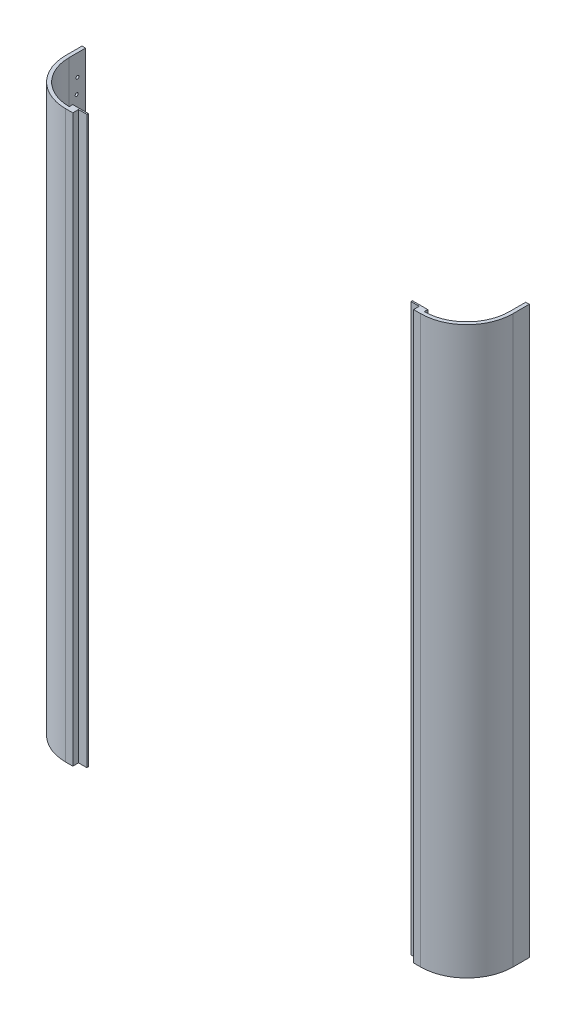
ISO-10303-21;
HEADER;
FILE_DESCRIPTION(('STEP AP214'),'2;1');
FILE_NAME('part.step','',(''),(''),'','','');
FILE_SCHEMA(('AUTOMOTIVE_DESIGN { 1 0 10303 214 1 1 1 1 }'));
ENDSEC;
DATA;
#1=APPLICATION_CONTEXT('core data for automotive mechanical design processes');
#2=APPLICATION_PROTOCOL_DEFINITION('international standard','automotive_design',2000,#1);
#3=PRODUCT_CONTEXT('',#1,'mechanical');
#4=PRODUCT('Part','Part','',(#3));
#5=PRODUCT_RELATED_PRODUCT_CATEGORY('part','',(#4));
#6=PRODUCT_DEFINITION_FORMATION('','',#4);
#7=PRODUCT_DEFINITION_CONTEXT('part definition',#1,'design');
#8=PRODUCT_DEFINITION('design','',#6,#7);
#9=PRODUCT_DEFINITION_SHAPE('','',#8);
#10=(LENGTH_UNIT() NAMED_UNIT(*) SI_UNIT(.MILLI.,.METRE.));
#11=(NAMED_UNIT(*) PLANE_ANGLE_UNIT() SI_UNIT($,.RADIAN.));
#12=(NAMED_UNIT(*) SI_UNIT($,.STERADIAN.) SOLID_ANGLE_UNIT());
#13=UNCERTAINTY_MEASURE_WITH_UNIT(LENGTH_MEASURE(1.E-05),#10,'distance_accuracy_value','');
#14=(GEOMETRIC_REPRESENTATION_CONTEXT(3) GLOBAL_UNCERTAINTY_ASSIGNED_CONTEXT((#13)) GLOBAL_UNIT_ASSIGNED_CONTEXT((#10,
#11,#12)) REPRESENTATION_CONTEXT('',''));
#15=CARTESIAN_POINT('',(0.,0.,0.));
#16=DIRECTION('',(0.,0.,1.));
#17=DIRECTION('',(1.,0.,0.));
#18=AXIS2_PLACEMENT_3D('',#15,#16,#17);
#19=CARTESIAN_POINT('',(-278.622282089204,797.,248.670625797988));
#20=DIRECTION('',(0.,-1.,0.));
#21=DIRECTION('',(0.,0.,-1.));
#22=AXIS2_PLACEMENT_3D('',#19,#20,#21);
#23=CYLINDRICAL_SURFACE('',#22,65.);
#24=CARTESIAN_POINT('',(-278.622282089204,0.,248.670625797988));
#25=DIRECTION('',(0.,1.,0.));
#26=DIRECTION('',(0.,0.,-1.));
#27=AXIS2_PLACEMENT_3D('',#24,#25,#26);
#28=CIRCLE('',#27,65.);
#29=CARTESIAN_POINT('',(-343.622282089204,0.,248.670625797988));
#30=VERTEX_POINT('',#29);
#31=CARTESIAN_POINT('',(-278.622282089204,0.,313.670625797988));
#32=VERTEX_POINT('',#31);
#33=EDGE_CURVE('E12',#30,#32,#28,.T.);
#34=ORIENTED_EDGE('',*,*,#33,.T.);
#35=DIRECTION('',(0.,-1.,0.));
#36=VECTOR('',#35,1.);
#37=CARTESIAN_POINT('',(-278.622282089204,797.,313.670625797988));
#38=LINE('',#37,#36);
#39=CARTESIAN_POINT('',(-278.622282089204,797.,313.670625797988));
#40=VERTEX_POINT('',#39);
#41=EDGE_CURVE('E251',#40,#32,#38,.T.);
#42=ORIENTED_EDGE('',*,*,#41,.F.);
#43=CARTESIAN_POINT('',(-278.622282089204,797.,248.670625797988));
#44=DIRECTION('',(0.,1.,0.));
#45=DIRECTION('',(0.,0.,-1.));
#46=AXIS2_PLACEMENT_3D('',#43,#44,#45);
#47=CIRCLE('',#46,65.);
#48=CARTESIAN_POINT('',(-343.622282089204,797.,248.670625797988));
#49=VERTEX_POINT('',#48);
#50=EDGE_CURVE('E57',#49,#40,#47,.T.);
#51=ORIENTED_EDGE('',*,*,#50,.F.);
#52=DIRECTION('',(0.,-1.,0.));
#53=VECTOR('',#52,1.);
#54=CARTESIAN_POINT('',(-343.622282089204,797.,248.670625797988));
#55=LINE('',#54,#53);
#56=EDGE_CURVE('E175',#49,#30,#55,.T.);
#57=ORIENTED_EDGE('',*,*,#56,.T.);
#58=EDGE_LOOP('',(#34,#42,#51,#57));
#59=FACE_BOUND('',#58,.T.);
#60=ADVANCED_FACE('F53',(#59),#23,.T.);
#61=CARTESIAN_POINT('',(-278.622282089204,797.,313.670625797988));
#62=DIRECTION('',(0.,0.,-1.));
#63=DIRECTION('',(-1.,0.,0.));
#64=AXIS2_PLACEMENT_3D('',#61,#62,#63);
#65=PLANE('',#64);
#66=DIRECTION('',(1.,0.,0.));
#67=VECTOR('',#66,1.);
#68=CARTESIAN_POINT('',(-278.622282089204,0.,313.670625797988));
#69=LINE('',#68,#67);
#70=CARTESIAN_POINT('',(-268.622282089204,0.,313.670625797988));
#71=VERTEX_POINT('',#70);
#72=EDGE_CURVE('E63',#32,#71,#69,.T.);
#73=ORIENTED_EDGE('',*,*,#72,.T.);
#74=DIRECTION('',(0.,-1.,0.));
#75=VECTOR('',#74,1.);
#76=CARTESIAN_POINT('',(-268.622282089204,797.,313.670625797988));
#77=LINE('',#76,#75);
#78=CARTESIAN_POINT('',(-268.622282089204,797.,313.670625797988));
#79=VERTEX_POINT('',#78);
#80=EDGE_CURVE('E151',#79,#71,#77,.T.);
#81=ORIENTED_EDGE('',*,*,#80,.F.);
#82=DIRECTION('',(1.,0.,0.));
#83=VECTOR('',#82,1.);
#84=CARTESIAN_POINT('',(-278.622282089204,797.,313.670625797988));
#85=LINE('',#84,#83);
#86=EDGE_CURVE('E108',#40,#79,#85,.T.);
#87=ORIENTED_EDGE('',*,*,#86,.F.);
#88=ORIENTED_EDGE('',*,*,#41,.T.);
#89=EDGE_LOOP('',(#73,#81,#87,#88));
#90=FACE_BOUND('',#89,.T.);
#91=ADVANCED_FACE('F353',(#90),#65,.F.);
#92=CARTESIAN_POINT('',(-268.622282089204,797.,308.670625797988));
#93=DIRECTION('',(-1.,0.,0.));
#94=DIRECTION('',(0.,0.,1.));
#95=AXIS2_PLACEMENT_3D('',#92,#93,#94);
#96=PLANE('',#95);
#97=DIRECTION('',(0.,0.,-1.));
#98=VECTOR('',#97,1.);
#99=CARTESIAN_POINT('',(-268.622282089204,0.,308.670625797988));
#100=LINE('',#99,#98);
#101=CARTESIAN_POINT('',(-268.622282089204,0.,305.670625797988));
#102=VERTEX_POINT('',#101);
#103=EDGE_CURVE('E145',#71,#102,#100,.T.);
#104=ORIENTED_EDGE('',*,*,#103,.T.);
#105=DIRECTION('',(0.,-1.,0.));
#106=VECTOR('',#105,1.);
#107=CARTESIAN_POINT('',(-268.622282089204,797.,305.670625797988));
#108=LINE('',#107,#106);
#109=CARTESIAN_POINT('',(-268.622282089204,797.,305.670625797988));
#110=VERTEX_POINT('',#109);
#111=EDGE_CURVE('E149',#110,#102,#108,.T.);
#112=ORIENTED_EDGE('',*,*,#111,.F.);
#113=DIRECTION('',(0.,0.,-1.));
#114=VECTOR('',#113,1.);
#115=CARTESIAN_POINT('',(-268.622282089204,797.,313.670625797988));
#116=LINE('',#115,#114);
#117=EDGE_CURVE('E188',#79,#110,#116,.T.);
#118=ORIENTED_EDGE('',*,*,#117,.F.);
#119=ORIENTED_EDGE('',*,*,#80,.T.);
#120=EDGE_LOOP('',(#104,#112,#118,#119));
#121=FACE_BOUND('',#120,.T.);
#122=ADVANCED_FACE('F147',(#121),#96,.F.);
#123=CARTESIAN_POINT('',(-268.622282089204,797.,305.670625797988));
#124=DIRECTION('',(0.,0.,-1.));
#125=DIRECTION('',(-1.,0.,0.));
#126=AXIS2_PLACEMENT_3D('',#123,#124,#125);
#127=PLANE('',#126);
#128=DIRECTION('',(1.,0.,0.));
#129=VECTOR('',#128,1.);
#130=CARTESIAN_POINT('',(-268.622282089204,0.,305.670625797988));
#131=LINE('',#130,#129);
#132=CARTESIAN_POINT('',(-256.854692604797,0.,305.670625797988));
#133=VERTEX_POINT('',#132);
#134=EDGE_CURVE('E153',#102,#133,#131,.T.);
#135=ORIENTED_EDGE('',*,*,#134,.T.);
#136=DIRECTION('',(0.,-1.,0.));
#137=VECTOR('',#136,1.);
#138=CARTESIAN_POINT('',(-256.854692604797,797.,305.670625797988));
#139=LINE('',#138,#137);
#140=CARTESIAN_POINT('',(-256.854692604797,797.,305.670625797988));
#141=VERTEX_POINT('',#140);
#142=EDGE_CURVE('E160',#141,#133,#139,.T.);
#143=ORIENTED_EDGE('',*,*,#142,.F.);
#144=DIRECTION('',(1.,0.,0.));
#145=VECTOR('',#144,1.);
#146=CARTESIAN_POINT('',(-268.622282089204,797.,305.670625797988));
#147=LINE('',#146,#145);
#148=EDGE_CURVE('E159',#110,#141,#147,.T.);
#149=ORIENTED_EDGE('',*,*,#148,.F.);
#150=ORIENTED_EDGE('',*,*,#111,.T.);
#151=EDGE_LOOP('',(#135,#143,#149,#150));
#152=FACE_BOUND('',#151,.T.);
#153=ADVANCED_FACE('F156',(#152),#127,.F.);
#154=CARTESIAN_POINT('',(-256.854692604797,797.,305.670625797988));
#155=DIRECTION('',(-1.,0.,0.));
#156=DIRECTION('',(0.,0.,1.));
#157=AXIS2_PLACEMENT_3D('',#154,#155,#156);
#158=PLANE('',#157);
#159=DIRECTION('',(0.,0.,-1.));
#160=VECTOR('',#159,1.);
#161=CARTESIAN_POINT('',(-256.854692604797,0.,305.670625797988));
#162=LINE('',#161,#160);
#163=CARTESIAN_POINT('',(-256.854692604797,0.,303.670625797988));
#164=VERTEX_POINT('',#163);
#165=EDGE_CURVE('E165',#133,#164,#162,.T.);
#166=ORIENTED_EDGE('',*,*,#165,.T.);
#167=DIRECTION('',(0.,-1.,0.));
#168=VECTOR('',#167,1.);
#169=CARTESIAN_POINT('',(-256.854692604797,797.,303.670625797988));
#170=LINE('',#169,#168);
#171=CARTESIAN_POINT('',(-256.854692604797,797.,303.670625797988));
#172=VERTEX_POINT('',#171);
#173=EDGE_CURVE('E211',#172,#164,#170,.T.);
#174=ORIENTED_EDGE('',*,*,#173,.F.);
#175=DIRECTION('',(0.,0.,-1.));
#176=VECTOR('',#175,1.);
#177=CARTESIAN_POINT('',(-256.854692604797,797.,305.670625797988));
#178=LINE('',#177,#176);
#179=EDGE_CURVE('E185',#141,#172,#178,.T.);
#180=ORIENTED_EDGE('',*,*,#179,.F.);
#181=ORIENTED_EDGE('',*,*,#142,.T.);
#182=EDGE_LOOP('',(#166,#174,#180,#181));
#183=FACE_BOUND('',#182,.T.);
#184=ADVANCED_FACE('F246',(#183),#158,.F.);
#185=CARTESIAN_POINT('',(-256.854692604797,797.,303.670625797988));
#186=DIRECTION('',(0.,0.,1.));
#187=DIRECTION('',(1.,0.,0.));
#188=AXIS2_PLACEMENT_3D('',#185,#186,#187);
#189=PLANE('',#188);
#190=DIRECTION('',(-1.,0.,0.));
#191=VECTOR('',#190,1.);
#192=CARTESIAN_POINT('',(-256.854692604797,0.,303.670625797988));
#193=LINE('',#192,#191);
#194=CARTESIAN_POINT('',(-278.622282089204,0.,303.670625797988));
#195=VERTEX_POINT('',#194);
#196=EDGE_CURVE('E167',#164,#195,#193,.T.);
#197=ORIENTED_EDGE('',*,*,#196,.T.);
#198=DIRECTION('',(0.,-1.,0.));
#199=VECTOR('',#198,1.);
#200=CARTESIAN_POINT('',(-278.622282089204,797.,303.670625797988));
#201=LINE('',#200,#199);
#202=CARTESIAN_POINT('',(-278.622282089204,797.,303.670625797988));
#203=VERTEX_POINT('',#202);
#204=EDGE_CURVE('E208',#203,#195,#201,.T.);
#205=ORIENTED_EDGE('',*,*,#204,.F.);
#206=DIRECTION('',(-1.,0.,0.));
#207=VECTOR('',#206,1.);
#208=CARTESIAN_POINT('',(-256.854692604797,797.,303.670625797988));
#209=LINE('',#208,#207);
#210=EDGE_CURVE('E183',#172,#203,#209,.T.);
#211=ORIENTED_EDGE('',*,*,#210,.F.);
#212=ORIENTED_EDGE('',*,*,#173,.T.);
#213=EDGE_LOOP('',(#197,#205,#211,#212));
#214=FACE_BOUND('',#213,.T.);
#215=ADVANCED_FACE('F206',(#214),#189,.F.);
#216=CARTESIAN_POINT('',(-278.622282089204,797.,303.670625797988));
#217=DIRECTION('',(1.,0.,0.));
#218=DIRECTION('',(0.,0.,-1.));
#219=AXIS2_PLACEMENT_3D('',#216,#217,#218);
#220=PLANE('',#219);
#221=DIRECTION('',(0.,0.,1.));
#222=VECTOR('',#221,1.);
#223=CARTESIAN_POINT('',(-278.622282089204,0.,303.670625797988));
#224=LINE('',#223,#222);
#225=CARTESIAN_POINT('',(-278.622282089204,0.,308.670625797988));
#226=VERTEX_POINT('',#225);
#227=EDGE_CURVE('E201',#195,#226,#224,.T.);
#228=ORIENTED_EDGE('',*,*,#227,.T.);
#229=DIRECTION('',(0.,-1.,0.));
#230=VECTOR('',#229,1.);
#231=CARTESIAN_POINT('',(-278.622282089204,797.,308.670625797988));
#232=LINE('',#231,#230);
#233=CARTESIAN_POINT('',(-278.622282089204,797.,308.670625797988));
#234=VERTEX_POINT('',#233);
#235=EDGE_CURVE('E217',#234,#226,#232,.T.);
#236=ORIENTED_EDGE('',*,*,#235,.F.);
#237=DIRECTION('',(0.,0.,1.));
#238=VECTOR('',#237,1.);
#239=CARTESIAN_POINT('',(-278.622282089204,797.,303.670625797988));
#240=LINE('',#239,#238);
#241=EDGE_CURVE('E181',#203,#234,#240,.T.);
#242=ORIENTED_EDGE('',*,*,#241,.F.);
#243=ORIENTED_EDGE('',*,*,#204,.T.);
#244=EDGE_LOOP('',(#228,#236,#242,#243));
#245=FACE_BOUND('',#244,.T.);
#246=ADVANCED_FACE('F214',(#245),#220,.F.);
#247=CARTESIAN_POINT('',(-278.622282089204,797.,248.670625797988));
#248=DIRECTION('',(0.,-1.,0.));
#249=DIRECTION('',(0.,0.,-1.));
#250=AXIS2_PLACEMENT_3D('',#247,#248,#249);
#251=CYLINDRICAL_SURFACE('',#250,60.);
#252=CARTESIAN_POINT('',(-278.622282089204,0.,248.670625797988));
#253=DIRECTION('',(0.,-1.,0.));
#254=DIRECTION('',(0.,0.,-1.));
#255=AXIS2_PLACEMENT_3D('',#252,#253,#254);
#256=CIRCLE('',#255,60.);
#257=CARTESIAN_POINT('',(-338.622282089204,0.,248.670625797988));
#258=VERTEX_POINT('',#257);
#259=EDGE_CURVE('E199',#226,#258,#256,.T.);
#260=ORIENTED_EDGE('',*,*,#259,.T.);
#261=DIRECTION('',(0.,-1.,0.));
#262=VECTOR('',#261,1.);
#263=CARTESIAN_POINT('',(-338.622282089204,797.,248.670625797988));
#264=LINE('',#263,#262);
#265=CARTESIAN_POINT('',(-338.622282089204,797.,248.670625797988));
#266=VERTEX_POINT('',#265);
#267=EDGE_CURVE('E227',#266,#258,#264,.T.);
#268=ORIENTED_EDGE('',*,*,#267,.F.);
#269=CARTESIAN_POINT('',(-278.622282089204,797.,248.670625797988));
#270=DIRECTION('',(0.,-1.,0.));
#271=DIRECTION('',(0.,0.,-1.));
#272=AXIS2_PLACEMENT_3D('',#269,#270,#271);
#273=CIRCLE('',#272,60.);
#274=EDGE_CURVE('E179',#234,#266,#273,.T.);
#275=ORIENTED_EDGE('',*,*,#274,.F.);
#276=ORIENTED_EDGE('',*,*,#235,.T.);
#277=EDGE_LOOP('',(#260,#268,#275,#276));
#278=FACE_BOUND('',#277,.T.);
#279=ADVANCED_FACE('F225',(#278),#251,.F.);
#280=CARTESIAN_POINT('',(-338.622282089204,797.,248.670625797988));
#281=DIRECTION('',(-1.,0.,0.));
#282=DIRECTION('',(0.,0.,1.));
#283=AXIS2_PLACEMENT_3D('',#280,#281,#282);
#284=PLANE('',#283);
#285=CARTESIAN_POINT('',(-338.622282089204,767.,237.170625797988));
#286=DIRECTION('',(-1.,0.,0.));
#287=DIRECTION('',(0.,0.,1.));
#288=AXIS2_PLACEMENT_3D('',#285,#286,#287);
#289=CIRCLE('',#288,2.15000000000002);
#290=CARTESIAN_POINT('',(-338.622282089204,767.,239.320625797988));
#291=VERTEX_POINT('',#290);
#292=EDGE_CURVE('E253',#291,#291,#289,.T.);
#293=ORIENTED_EDGE('',*,*,#292,.T.);
#294=EDGE_LOOP('',(#293));
#295=FACE_BOUND('',#294,.T.);
#296=CARTESIAN_POINT('',(-338.622282089204,44.0000000000001,237.170625797988));
#297=DIRECTION('',(-1.,0.,0.));
#298=DIRECTION('',(0.,0.,1.));
#299=AXIS2_PLACEMENT_3D('',#296,#297,#298);
#300=CIRCLE('',#299,2.15000000000002);
#301=CARTESIAN_POINT('',(-338.622282089204,44.0000000000001,239.320625797988));
#302=VERTEX_POINT('',#301);
#303=EDGE_CURVE('E256',#302,#302,#300,.T.);
#304=ORIENTED_EDGE('',*,*,#303,.T.);
#305=EDGE_LOOP('',(#304));
#306=FACE_BOUND('',#305,.T.);
#307=CARTESIAN_POINT('',(-338.622282089204,426.,237.170625797988));
#308=DIRECTION('',(-1.,0.,0.));
#309=DIRECTION('',(0.,0.,1.));
#310=AXIS2_PLACEMENT_3D('',#307,#308,#309);
#311=CIRCLE('',#310,2.15000000000002);
#312=CARTESIAN_POINT('',(-338.622282089204,426.,239.320625797988));
#313=VERTEX_POINT('',#312);
#314=EDGE_CURVE('E259',#313,#313,#311,.T.);
#315=ORIENTED_EDGE('',*,*,#314,.T.);
#316=EDGE_LOOP('',(#315));
#317=FACE_BOUND('',#316,.T.);
#318=CARTESIAN_POINT('',(-338.622282089204,405.5,238.170625797988));
#319=DIRECTION('',(-1.,0.,0.));
#320=DIRECTION('',(0.,0.,1.));
#321=AXIS2_PLACEMENT_3D('',#318,#319,#320);
#322=CIRCLE('',#321,2.15000000000002);
#323=CARTESIAN_POINT('',(-338.622282089204,405.5,240.320625797988));
#324=VERTEX_POINT('',#323);
#325=EDGE_CURVE('E262',#324,#324,#322,.T.);
#326=ORIENTED_EDGE('',*,*,#325,.T.);
#327=EDGE_LOOP('',(#326));
#328=FACE_BOUND('',#327,.T.);
#329=CARTESIAN_POINT('',(-338.622282089204,385.,237.170625797988));
#330=DIRECTION('',(-1.,0.,0.));
#331=DIRECTION('',(0.,0.,1.));
#332=AXIS2_PLACEMENT_3D('',#329,#330,#331);
#333=CIRCLE('',#332,2.15000000000002);
#334=CARTESIAN_POINT('',(-338.622282089204,385.,239.320625797988));
#335=VERTEX_POINT('',#334);
#336=EDGE_CURVE('E265',#335,#335,#333,.T.);
#337=ORIENTED_EDGE('',*,*,#336,.T.);
#338=EDGE_LOOP('',(#337));
#339=FACE_BOUND('',#338,.T.);
#340=CARTESIAN_POINT('',(-338.622282089204,746.5,238.170625797988));
#341=DIRECTION('',(-1.,0.,0.));
#342=DIRECTION('',(0.,0.,1.));
#343=AXIS2_PLACEMENT_3D('',#340,#341,#342);
#344=CIRCLE('',#343,2.15000000000002);
#345=CARTESIAN_POINT('',(-338.622282089204,746.5,240.320625797988));
#346=VERTEX_POINT('',#345);
#347=EDGE_CURVE('E268',#346,#346,#344,.T.);
#348=ORIENTED_EDGE('',*,*,#347,.T.);
#349=EDGE_LOOP('',(#348));
#350=FACE_BOUND('',#349,.T.);
#351=CARTESIAN_POINT('',(-338.622282089204,85.0000000000001,237.170625797988));
#352=DIRECTION('',(-1.,0.,0.));
#353=DIRECTION('',(0.,0.,1.));
#354=AXIS2_PLACEMENT_3D('',#351,#352,#353);
#355=CIRCLE('',#354,2.15000000000001);
#356=CARTESIAN_POINT('',(-338.622282089204,85.0000000000001,239.320625797988));
#357=VERTEX_POINT('',#356);
#358=EDGE_CURVE('E271',#357,#357,#355,.T.);
#359=ORIENTED_EDGE('',*,*,#358,.T.);
#360=EDGE_LOOP('',(#359));
#361=FACE_BOUND('',#360,.T.);
#362=CARTESIAN_POINT('',(-338.622282089204,726.,237.170625797988));
#363=DIRECTION('',(-1.,0.,0.));
#364=DIRECTION('',(0.,0.,1.));
#365=AXIS2_PLACEMENT_3D('',#362,#363,#364);
#366=CIRCLE('',#365,2.15000000000002);
#367=CARTESIAN_POINT('',(-338.622282089204,726.,239.320625797988));
#368=VERTEX_POINT('',#367);
#369=EDGE_CURVE('E274',#368,#368,#366,.T.);
#370=ORIENTED_EDGE('',*,*,#369,.T.);
#371=EDGE_LOOP('',(#370));
#372=FACE_BOUND('',#371,.T.);
#373=CARTESIAN_POINT('',(-338.622282089204,64.5000000000001,238.170625797988));
#374=DIRECTION('',(-1.,0.,0.));
#375=DIRECTION('',(0.,0.,1.));
#376=AXIS2_PLACEMENT_3D('',#373,#374,#375);
#377=CIRCLE('',#376,2.15000000000001);
#378=CARTESIAN_POINT('',(-338.622282089204,64.5000000000001,240.320625797988));
#379=VERTEX_POINT('',#378);
#380=EDGE_CURVE('E277',#379,#379,#377,.T.);
#381=ORIENTED_EDGE('',*,*,#380,.T.);
#382=EDGE_LOOP('',(#381));
#383=FACE_BOUND('',#382,.T.);
#384=DIRECTION('',(0.,0.,-1.));
#385=VECTOR('',#384,1.);
#386=CARTESIAN_POINT('',(-338.622282089204,0.,248.670625797988));
#387=LINE('',#386,#385);
#388=CARTESIAN_POINT('',(-338.622282089204,0.,225.670625797988));
#389=VERTEX_POINT('',#388);
#390=EDGE_CURVE('E193',#258,#389,#387,.T.);
#391=ORIENTED_EDGE('',*,*,#390,.T.);
#392=DIRECTION('',(0.,-1.,0.));
#393=VECTOR('',#392,1.);
#394=CARTESIAN_POINT('',(-338.622282089204,797.,225.670625797988));
#395=LINE('',#394,#393);
#396=CARTESIAN_POINT('',(-338.622282089204,797.,225.670625797988));
#397=VERTEX_POINT('',#396);
#398=EDGE_CURVE('E233',#397,#389,#395,.T.);
#399=ORIENTED_EDGE('',*,*,#398,.F.);
#400=DIRECTION('',(0.,0.,-1.));
#401=VECTOR('',#400,1.);
#402=CARTESIAN_POINT('',(-338.622282089204,797.,248.670625797988));
#403=LINE('',#402,#401);
#404=EDGE_CURVE('E177',#266,#397,#403,.T.);
#405=ORIENTED_EDGE('',*,*,#404,.F.);
#406=ORIENTED_EDGE('',*,*,#267,.T.);
#407=EDGE_LOOP('',(#391,#399,#405,#406));
#408=FACE_BOUND('',#407,.T.);
#409=ADVANCED_FACE('F230',(#295,#306,#317,#328,#339,#350,#361,#372,#383,#408),#284,.F.);
#410=CARTESIAN_POINT('',(-343.622282089204,797.,225.670625797988));
#411=DIRECTION('',(0.,0.,1.));
#412=DIRECTION('',(1.,0.,0.));
#413=AXIS2_PLACEMENT_3D('',#410,#411,#412);
#414=PLANE('',#413);
#415=DIRECTION('',(-1.,0.,0.));
#416=VECTOR('',#415,1.);
#417=CARTESIAN_POINT('',(-343.622282089204,0.,225.670625797988));
#418=LINE('',#417,#416);
#419=CARTESIAN_POINT('',(-343.622282089204,0.,225.670625797988));
#420=VERTEX_POINT('',#419);
#421=EDGE_CURVE('E191',#389,#420,#418,.T.);
#422=ORIENTED_EDGE('',*,*,#421,.T.);
#423=DIRECTION('',(0.,-1.,0.));
#424=VECTOR('',#423,1.);
#425=CARTESIAN_POINT('',(-343.622282089204,797.,225.670625797988));
#426=LINE('',#425,#424);
#427=CARTESIAN_POINT('',(-343.622282089204,797.,225.670625797988));
#428=VERTEX_POINT('',#427);
#429=EDGE_CURVE('E235',#428,#420,#426,.T.);
#430=ORIENTED_EDGE('',*,*,#429,.F.);
#431=DIRECTION('',(-1.,0.,0.));
#432=VECTOR('',#431,1.);
#433=CARTESIAN_POINT('',(-343.622282089204,797.,225.670625797988));
#434=LINE('',#433,#432);
#435=EDGE_CURVE('E174',#397,#428,#434,.T.);
#436=ORIENTED_EDGE('',*,*,#435,.F.);
#437=ORIENTED_EDGE('',*,*,#398,.T.);
#438=EDGE_LOOP('',(#422,#430,#436,#437));
#439=FACE_BOUND('',#438,.T.);
#440=ADVANCED_FACE('F242',(#439),#414,.F.);
#441=CARTESIAN_POINT('',(-343.622282089204,797.,248.670625797988));
#442=DIRECTION('',(1.,0.,0.));
#443=DIRECTION('',(0.,0.,-1.));
#444=AXIS2_PLACEMENT_3D('',#441,#442,#443);
#445=PLANE('',#444);
#446=CARTESIAN_POINT('',(-343.622282089204,767.,237.170625797988));
#447=DIRECTION('',(1.,0.,0.));
#448=DIRECTION('',(0.,0.,-1.));
#449=AXIS2_PLACEMENT_3D('',#446,#447,#448);
#450=CIRCLE('',#449,2.15000000000002);
#451=CARTESIAN_POINT('',(-343.622282089204,767.,235.020625797988));
#452=VERTEX_POINT('',#451);
#453=EDGE_CURVE('E280',#452,#452,#450,.T.);
#454=ORIENTED_EDGE('',*,*,#453,.T.);
#455=EDGE_LOOP('',(#454));
#456=FACE_BOUND('',#455,.T.);
#457=CARTESIAN_POINT('',(-343.622282089204,44.0000000000001,237.170625797988));
#458=DIRECTION('',(1.,0.,0.));
#459=DIRECTION('',(0.,0.,1.));
#460=AXIS2_PLACEMENT_3D('',#457,#458,#459);
#461=CIRCLE('',#460,2.15000000000002);
#462=CARTESIAN_POINT('',(-343.622282089204,44.0000000000001,239.320625797988));
#463=VERTEX_POINT('',#462);
#464=EDGE_CURVE('E291',#463,#463,#461,.T.);
#465=ORIENTED_EDGE('',*,*,#464,.T.);
#466=EDGE_LOOP('',(#465));
#467=FACE_BOUND('',#466,.T.);
#468=CARTESIAN_POINT('',(-343.622282089204,426.,237.170625797988));
#469=DIRECTION('',(1.,0.,0.));
#470=DIRECTION('',(0.,0.,-1.));
#471=AXIS2_PLACEMENT_3D('',#468,#469,#470);
#472=CIRCLE('',#471,2.15000000000002);
#473=CARTESIAN_POINT('',(-343.622282089204,426.,235.020625797988));
#474=VERTEX_POINT('',#473);
#475=EDGE_CURVE('E294',#474,#474,#472,.T.);
#476=ORIENTED_EDGE('',*,*,#475,.T.);
#477=EDGE_LOOP('',(#476));
#478=FACE_BOUND('',#477,.T.);
#479=CARTESIAN_POINT('',(-343.622282089204,405.5,238.170625797988));
#480=DIRECTION('',(1.,0.,0.));
#481=DIRECTION('',(0.,0.,-1.));
#482=AXIS2_PLACEMENT_3D('',#479,#480,#481);
#483=CIRCLE('',#482,2.15000000000002);
#484=CARTESIAN_POINT('',(-343.622282089204,405.5,236.020625797988));
#485=VERTEX_POINT('',#484);
#486=EDGE_CURVE('E297',#485,#485,#483,.T.);
#487=ORIENTED_EDGE('',*,*,#486,.T.);
#488=EDGE_LOOP('',(#487));
#489=FACE_BOUND('',#488,.T.);
#490=CARTESIAN_POINT('',(-343.622282089204,385.,237.170625797988));
#491=DIRECTION('',(1.,0.,0.));
#492=DIRECTION('',(0.,0.,-1.));
#493=AXIS2_PLACEMENT_3D('',#490,#491,#492);
#494=CIRCLE('',#493,2.15000000000002);
#495=CARTESIAN_POINT('',(-343.622282089204,385.,235.020625797988));
#496=VERTEX_POINT('',#495);
#497=EDGE_CURVE('E300',#496,#496,#494,.T.);
#498=ORIENTED_EDGE('',*,*,#497,.T.);
#499=EDGE_LOOP('',(#498));
#500=FACE_BOUND('',#499,.T.);
#501=CARTESIAN_POINT('',(-343.622282089204,746.5,238.170625797988));
#502=DIRECTION('',(1.,0.,0.));
#503=DIRECTION('',(0.,0.,-1.));
#504=AXIS2_PLACEMENT_3D('',#501,#502,#503);
#505=CIRCLE('',#504,2.15000000000002);
#506=CARTESIAN_POINT('',(-343.622282089204,746.5,236.020625797988));
#507=VERTEX_POINT('',#506);
#508=EDGE_CURVE('E284',#507,#507,#505,.T.);
#509=ORIENTED_EDGE('',*,*,#508,.T.);
#510=EDGE_LOOP('',(#509));
#511=FACE_BOUND('',#510,.T.);
#512=CARTESIAN_POINT('',(-343.622282089204,85.0000000000001,237.170625797988));
#513=DIRECTION('',(1.,0.,0.));
#514=DIRECTION('',(0.,0.,1.));
#515=AXIS2_PLACEMENT_3D('',#512,#513,#514);
#516=CIRCLE('',#515,2.15000000000001);
#517=CARTESIAN_POINT('',(-343.622282089204,85.0000000000001,239.320625797988));
#518=VERTEX_POINT('',#517);
#519=EDGE_CURVE('E281',#518,#518,#516,.T.);
#520=ORIENTED_EDGE('',*,*,#519,.T.);
#521=EDGE_LOOP('',(#520));
#522=FACE_BOUND('',#521,.T.);
#523=CARTESIAN_POINT('',(-343.622282089204,726.,237.170625797988));
#524=DIRECTION('',(1.,0.,0.));
#525=DIRECTION('',(0.,0.,-1.));
#526=AXIS2_PLACEMENT_3D('',#523,#524,#525);
#527=CIRCLE('',#526,2.15000000000002);
#528=CARTESIAN_POINT('',(-343.622282089204,726.,235.020625797988));
#529=VERTEX_POINT('',#528);
#530=EDGE_CURVE('E285',#529,#529,#527,.T.);
#531=ORIENTED_EDGE('',*,*,#530,.T.);
#532=EDGE_LOOP('',(#531));
#533=FACE_BOUND('',#532,.T.);
#534=CARTESIAN_POINT('',(-343.622282089204,64.5000000000001,238.170625797988));
#535=DIRECTION('',(1.,0.,0.));
#536=DIRECTION('',(0.,0.,1.));
#537=AXIS2_PLACEMENT_3D('',#534,#535,#536);
#538=CIRCLE('',#537,2.15000000000001);
#539=CARTESIAN_POINT('',(-343.622282089204,64.5000000000001,240.320625797988));
#540=VERTEX_POINT('',#539);
#541=EDGE_CURVE('E288',#540,#540,#538,.T.);
#542=ORIENTED_EDGE('',*,*,#541,.T.);
#543=EDGE_LOOP('',(#542));
#544=FACE_BOUND('',#543,.T.);
#545=DIRECTION('',(0.,0.,1.));
#546=VECTOR('',#545,1.);
#547=CARTESIAN_POINT('',(-343.622282089204,0.,248.670625797988));
#548=LINE('',#547,#546);
#549=EDGE_CURVE('E119',#420,#30,#548,.T.);
#550=ORIENTED_EDGE('',*,*,#549,.T.);
#551=ORIENTED_EDGE('',*,*,#56,.F.);
#552=DIRECTION('',(0.,0.,1.));
#553=VECTOR('',#552,1.);
#554=CARTESIAN_POINT('',(-343.622282089204,797.,248.670625797988));
#555=LINE('',#554,#553);
#556=EDGE_CURVE('E172',#428,#49,#555,.T.);
#557=ORIENTED_EDGE('',*,*,#556,.F.);
#558=ORIENTED_EDGE('',*,*,#429,.T.);
#559=EDGE_LOOP('',(#550,#551,#557,#558));
#560=FACE_BOUND('',#559,.T.);
#561=ADVANCED_FACE('F308',(#456,#467,#478,#489,#500,#511,#522,#533,#544,#560),#445,.F.);
#562=CARTESIAN_POINT('',(-278.622282089204,797.,248.670625797988));
#563=DIRECTION('',(0.,-1.,0.));
#564=DIRECTION('',(0.,0.,-1.));
#565=AXIS2_PLACEMENT_3D('',#562,#563,#564);
#566=PLANE('',#565);
#567=ORIENTED_EDGE('',*,*,#50,.T.);
#568=ORIENTED_EDGE('',*,*,#86,.T.);
#569=ORIENTED_EDGE('',*,*,#117,.T.);
#570=ORIENTED_EDGE('',*,*,#148,.T.);
#571=ORIENTED_EDGE('',*,*,#179,.T.);
#572=ORIENTED_EDGE('',*,*,#210,.T.);
#573=ORIENTED_EDGE('',*,*,#241,.T.);
#574=ORIENTED_EDGE('',*,*,#274,.T.);
#575=ORIENTED_EDGE('',*,*,#404,.T.);
#576=ORIENTED_EDGE('',*,*,#435,.T.);
#577=ORIENTED_EDGE('',*,*,#556,.T.);
#578=EDGE_LOOP('',(#567,#568,#569,#570,#571,#572,#573,#574,#575,#576,#577));
#579=FACE_BOUND('',#578,.T.);
#580=ADVANCED_FACE('F55',(#579),#566,.F.);
#581=CARTESIAN_POINT('',(-278.622282089204,0.,248.670625797988));
#582=DIRECTION('',(0.,-1.,0.));
#583=DIRECTION('',(0.,0.,-1.));
#584=AXIS2_PLACEMENT_3D('',#581,#582,#583);
#585=PLANE('',#584);
#586=ORIENTED_EDGE('',*,*,#33,.F.);
#587=ORIENTED_EDGE('',*,*,#549,.F.);
#588=ORIENTED_EDGE('',*,*,#421,.F.);
#589=ORIENTED_EDGE('',*,*,#390,.F.);
#590=ORIENTED_EDGE('',*,*,#259,.F.);
#591=ORIENTED_EDGE('',*,*,#227,.F.);
#592=ORIENTED_EDGE('',*,*,#196,.F.);
#593=ORIENTED_EDGE('',*,*,#165,.F.);
#594=ORIENTED_EDGE('',*,*,#134,.F.);
#595=ORIENTED_EDGE('',*,*,#103,.F.);
#596=ORIENTED_EDGE('',*,*,#72,.F.);
#597=EDGE_LOOP('',(#586,#587,#588,#589,#590,#591,#592,#593,#594,#595,#596));
#598=FACE_BOUND('',#597,.T.);
#599=ADVANCED_FACE('F163',(#598),#585,.T.);
#600=CARTESIAN_POINT('',(-343.622282089204,64.5000000000001,238.170625797988));
#601=DIRECTION('',(1.,0.,0.));
#602=DIRECTION('',(0.,0.,-1.));
#603=AXIS2_PLACEMENT_3D('',#600,#601,#602);
#604=CYLINDRICAL_SURFACE('',#603,2.15000000000001);
#605=ORIENTED_EDGE('',*,*,#541,.F.);
#606=EDGE_LOOP('',(#605));
#607=FACE_BOUND('',#606,.T.);
#608=ORIENTED_EDGE('',*,*,#380,.F.);
#609=EDGE_LOOP('',(#608));
#610=FACE_BOUND('',#609,.T.);
#611=ADVANCED_FACE('F337',(#607,#610),#604,.F.);
#612=CARTESIAN_POINT('',(-343.622282089204,726.,237.170625797988));
#613=DIRECTION('',(1.,0.,0.));
#614=DIRECTION('',(0.,0.,-1.));
#615=AXIS2_PLACEMENT_3D('',#612,#613,#614);
#616=CYLINDRICAL_SURFACE('',#615,2.15000000000002);
#617=ORIENTED_EDGE('',*,*,#530,.F.);
#618=EDGE_LOOP('',(#617));
#619=FACE_BOUND('',#618,.T.);
#620=ORIENTED_EDGE('',*,*,#369,.F.);
#621=EDGE_LOOP('',(#620));
#622=FACE_BOUND('',#621,.T.);
#623=ADVANCED_FACE('F339',(#619,#622),#616,.F.);
#624=CARTESIAN_POINT('',(-343.622282089204,85.0000000000001,237.170625797988));
#625=DIRECTION('',(1.,0.,0.));
#626=DIRECTION('',(0.,0.,-1.));
#627=AXIS2_PLACEMENT_3D('',#624,#625,#626);
#628=CYLINDRICAL_SURFACE('',#627,2.15000000000001);
#629=ORIENTED_EDGE('',*,*,#519,.F.);
#630=EDGE_LOOP('',(#629));
#631=FACE_BOUND('',#630,.T.);
#632=ORIENTED_EDGE('',*,*,#358,.F.);
#633=EDGE_LOOP('',(#632));
#634=FACE_BOUND('',#633,.T.);
#635=ADVANCED_FACE('F346',(#631,#634),#628,.F.);
#636=CARTESIAN_POINT('',(-343.622282089204,746.5,238.170625797988));
#637=DIRECTION('',(1.,0.,0.));
#638=DIRECTION('',(0.,0.,-1.));
#639=AXIS2_PLACEMENT_3D('',#636,#637,#638);
#640=CYLINDRICAL_SURFACE('',#639,2.15000000000002);
#641=ORIENTED_EDGE('',*,*,#508,.F.);
#642=EDGE_LOOP('',(#641));
#643=FACE_BOUND('',#642,.T.);
#644=ORIENTED_EDGE('',*,*,#347,.F.);
#645=EDGE_LOOP('',(#644));
#646=FACE_BOUND('',#645,.T.);
#647=ADVANCED_FACE('F425',(#643,#646),#640,.F.);
#648=CARTESIAN_POINT('',(-343.622282089204,385.,237.170625797988));
#649=DIRECTION('',(1.,0.,0.));
#650=DIRECTION('',(0.,0.,-1.));
#651=AXIS2_PLACEMENT_3D('',#648,#649,#650);
#652=CYLINDRICAL_SURFACE('',#651,2.15000000000002);
#653=ORIENTED_EDGE('',*,*,#497,.F.);
#654=EDGE_LOOP('',(#653));
#655=FACE_BOUND('',#654,.T.);
#656=ORIENTED_EDGE('',*,*,#336,.F.);
#657=EDGE_LOOP('',(#656));
#658=FACE_BOUND('',#657,.T.);
#659=ADVANCED_FACE('F433',(#655,#658),#652,.F.);
#660=CARTESIAN_POINT('',(-343.622282089204,405.5,238.170625797988));
#661=DIRECTION('',(1.,0.,0.));
#662=DIRECTION('',(0.,0.,-1.));
#663=AXIS2_PLACEMENT_3D('',#660,#661,#662);
#664=CYLINDRICAL_SURFACE('',#663,2.15000000000002);
#665=ORIENTED_EDGE('',*,*,#486,.F.);
#666=EDGE_LOOP('',(#665));
#667=FACE_BOUND('',#666,.T.);
#668=ORIENTED_EDGE('',*,*,#325,.F.);
#669=EDGE_LOOP('',(#668));
#670=FACE_BOUND('',#669,.T.);
#671=ADVANCED_FACE('F441',(#667,#670),#664,.F.);
#672=CARTESIAN_POINT('',(-343.622282089204,426.,237.170625797988));
#673=DIRECTION('',(1.,0.,0.));
#674=DIRECTION('',(0.,0.,-1.));
#675=AXIS2_PLACEMENT_3D('',#672,#673,#674);
#676=CYLINDRICAL_SURFACE('',#675,2.15000000000002);
#677=ORIENTED_EDGE('',*,*,#475,.F.);
#678=EDGE_LOOP('',(#677));
#679=FACE_BOUND('',#678,.T.);
#680=ORIENTED_EDGE('',*,*,#314,.F.);
#681=EDGE_LOOP('',(#680));
#682=FACE_BOUND('',#681,.T.);
#683=ADVANCED_FACE('F450',(#679,#682),#676,.F.);
#684=CARTESIAN_POINT('',(-343.622282089204,44.0000000000001,237.170625797988));
#685=DIRECTION('',(1.,0.,0.));
#686=DIRECTION('',(0.,0.,-1.));
#687=AXIS2_PLACEMENT_3D('',#684,#685,#686);
#688=CYLINDRICAL_SURFACE('',#687,2.15000000000002);
#689=ORIENTED_EDGE('',*,*,#464,.F.);
#690=EDGE_LOOP('',(#689));
#691=FACE_BOUND('',#690,.T.);
#692=ORIENTED_EDGE('',*,*,#303,.F.);
#693=EDGE_LOOP('',(#692));
#694=FACE_BOUND('',#693,.T.);
#695=ADVANCED_FACE('F314',(#691,#694),#688,.F.);
#696=CARTESIAN_POINT('',(-343.622282089204,767.,237.170625797988));
#697=DIRECTION('',(1.,0.,0.));
#698=DIRECTION('',(0.,0.,-1.));
#699=AXIS2_PLACEMENT_3D('',#696,#697,#698);
#700=CYLINDRICAL_SURFACE('',#699,2.15000000000002);
#701=ORIENTED_EDGE('',*,*,#453,.F.);
#702=EDGE_LOOP('',(#701));
#703=FACE_BOUND('',#702,.T.);
#704=ORIENTED_EDGE('',*,*,#292,.F.);
#705=EDGE_LOOP('',(#704));
#706=FACE_BOUND('',#705,.T.);
#707=ADVANCED_FACE('F311',(#703,#706),#700,.F.);
#708=CLOSED_SHELL('',(#60,#91,#122,#153,#184,#215,#246,#279,#409,#440,#561,#580,#599,#611,#623,
#635,#647,#659,#671,#683,#695,#707));
#709=MANIFOLD_SOLID_BREP('B2',#708);
#710=CARTESIAN_POINT('',(221.377717910796,797.,248.670625797988));
#711=DIRECTION('',(0.,-1.,0.));
#712=DIRECTION('',(0.,0.,-1.));
#713=AXIS2_PLACEMENT_3D('',#710,#711,#712);
#714=CYLINDRICAL_SURFACE('',#713,60.);
#715=CARTESIAN_POINT('',(221.377717910796,0.,248.670625797988));
#716=DIRECTION('',(0.,-1.,0.));
#717=DIRECTION('',(0.,0.,1.));
#718=AXIS2_PLACEMENT_3D('',#715,#716,#717);
#719=CIRCLE('',#718,60.);
#720=CARTESIAN_POINT('',(281.377717910796,0.,248.670625797988));
#721=VERTEX_POINT('',#720);
#722=CARTESIAN_POINT('',(221.377717910796,0.,308.670625797988));
#723=VERTEX_POINT('',#722);
#724=EDGE_CURVE('E665',#721,#723,#719,.T.);
#725=ORIENTED_EDGE('',*,*,#724,.T.);
#726=DIRECTION('',(0.,-1.,0.));
#727=VECTOR('',#726,1.);
#728=CARTESIAN_POINT('',(221.377717910796,797.,308.670625797988));
#729=LINE('',#728,#727);
#730=CARTESIAN_POINT('',(221.377717910796,797.,308.670625797988));
#731=VERTEX_POINT('',#730);
#732=EDGE_CURVE('E51',#731,#723,#729,.T.);
#733=ORIENTED_EDGE('',*,*,#732,.F.);
#734=CARTESIAN_POINT('',(221.377717910796,797.,248.670625797988));
#735=DIRECTION('',(0.,-1.,0.));
#736=DIRECTION('',(0.,0.,1.));
#737=AXIS2_PLACEMENT_3D('',#734,#735,#736);
#738=CIRCLE('',#737,60.);
#739=CARTESIAN_POINT('',(281.377717910796,797.,248.670625797988));
#740=VERTEX_POINT('',#739);
#741=EDGE_CURVE('E686',#740,#731,#738,.T.);
#742=ORIENTED_EDGE('',*,*,#741,.F.);
#743=DIRECTION('',(0.,-1.,0.));
#744=VECTOR('',#743,1.);
#745=CARTESIAN_POINT('',(281.377717910796,797.,248.670625797988));
#746=LINE('',#745,#744);
#747=EDGE_CURVE('E661',#740,#721,#746,.T.);
#748=ORIENTED_EDGE('',*,*,#747,.T.);
#749=EDGE_LOOP('',(#725,#733,#742,#748));
#750=FACE_BOUND('',#749,.T.);
#751=ADVANCED_FACE('F551',(#750),#714,.F.);
#752=CARTESIAN_POINT('',(221.377717910796,797.,303.670625797988));
#753=DIRECTION('',(-1.,0.,0.));
#754=DIRECTION('',(0.,0.,1.));
#755=AXIS2_PLACEMENT_3D('',#752,#753,#754);
#756=PLANE('',#755);
#757=DIRECTION('',(0.,0.,-1.));
#758=VECTOR('',#757,1.);
#759=CARTESIAN_POINT('',(221.377717910796,0.,303.670625797988));
#760=LINE('',#759,#758);
#761=CARTESIAN_POINT('',(221.377717910796,0.,303.670625797988));
#762=VERTEX_POINT('',#761);
#763=EDGE_CURVE('E668',#723,#762,#760,.T.);
#764=ORIENTED_EDGE('',*,*,#763,.T.);
#765=DIRECTION('',(0.,-1.,0.));
#766=VECTOR('',#765,1.);
#767=CARTESIAN_POINT('',(221.377717910796,797.,303.670625797988));
#768=LINE('',#767,#766);
#769=CARTESIAN_POINT('',(221.377717910796,797.,303.670625797988));
#770=VERTEX_POINT('',#769);
#771=EDGE_CURVE('E559',#770,#762,#768,.T.);
#772=ORIENTED_EDGE('',*,*,#771,.F.);
#773=DIRECTION('',(0.,0.,-1.));
#774=VECTOR('',#773,1.);
#775=CARTESIAN_POINT('',(221.377717910796,797.,303.670625797988));
#776=LINE('',#775,#774);
#777=EDGE_CURVE('E619',#731,#770,#776,.T.);
#778=ORIENTED_EDGE('',*,*,#777,.F.);
#779=ORIENTED_EDGE('',*,*,#732,.T.);
#780=EDGE_LOOP('',(#764,#772,#778,#779));
#781=FACE_BOUND('',#780,.T.);
#782=ADVANCED_FACE('F757',(#781),#756,.F.);
#783=CARTESIAN_POINT('',(199.610128426388,797.,303.670625797988));
#784=DIRECTION('',(0.,0.,1.));
#785=DIRECTION('',(1.,0.,0.));
#786=AXIS2_PLACEMENT_3D('',#783,#784,#785);
#787=PLANE('',#786);
#788=DIRECTION('',(-1.,0.,0.));
#789=VECTOR('',#788,1.);
#790=CARTESIAN_POINT('',(199.610128426388,0.,303.670625797988));
#791=LINE('',#790,#789);
#792=CARTESIAN_POINT('',(199.610128426388,0.,303.670625797988));
#793=VERTEX_POINT('',#792);
#794=EDGE_CURVE('E670',#762,#793,#791,.T.);
#795=ORIENTED_EDGE('',*,*,#794,.T.);
#796=DIRECTION('',(0.,-1.,0.));
#797=VECTOR('',#796,1.);
#798=CARTESIAN_POINT('',(199.610128426388,797.,303.670625797988));
#799=LINE('',#798,#797);
#800=CARTESIAN_POINT('',(199.610128426388,797.,303.670625797988));
#801=VERTEX_POINT('',#800);
#802=EDGE_CURVE('E702',#801,#793,#799,.T.);
#803=ORIENTED_EDGE('',*,*,#802,.F.);
#804=DIRECTION('',(-1.,0.,0.));
#805=VECTOR('',#804,1.);
#806=CARTESIAN_POINT('',(199.610128426388,797.,303.670625797988));
#807=LINE('',#806,#805);
#808=EDGE_CURVE('E710',#770,#801,#807,.T.);
#809=ORIENTED_EDGE('',*,*,#808,.F.);
#810=ORIENTED_EDGE('',*,*,#771,.T.);
#811=EDGE_LOOP('',(#795,#803,#809,#810));
#812=FACE_BOUND('',#811,.T.);
#813=ADVANCED_FACE('F708',(#812),#787,.F.);
#814=CARTESIAN_POINT('',(199.610128426388,797.,305.670625797988));
#815=DIRECTION('',(1.,0.,0.));
#816=DIRECTION('',(0.,0.,-1.));
#817=AXIS2_PLACEMENT_3D('',#814,#815,#816);
#818=PLANE('',#817);
#819=DIRECTION('',(0.,0.,1.));
#820=VECTOR('',#819,1.);
#821=CARTESIAN_POINT('',(199.610128426388,0.,305.670625797988));
#822=LINE('',#821,#820);
#823=CARTESIAN_POINT('',(199.610128426388,0.,305.670625797988));
#824=VERTEX_POINT('',#823);
#825=EDGE_CURVE('E672',#793,#824,#822,.T.);
#826=ORIENTED_EDGE('',*,*,#825,.T.);
#827=DIRECTION('',(0.,-1.,0.));
#828=VECTOR('',#827,1.);
#829=CARTESIAN_POINT('',(199.610128426388,797.,305.670625797988));
#830=LINE('',#829,#828);
#831=CARTESIAN_POINT('',(199.610128426388,797.,305.670625797988));
#832=VERTEX_POINT('',#831);
#833=EDGE_CURVE('E699',#832,#824,#830,.T.);
#834=ORIENTED_EDGE('',*,*,#833,.F.);
#835=DIRECTION('',(0.,0.,1.));
#836=VECTOR('',#835,1.);
#837=CARTESIAN_POINT('',(199.610128426388,797.,305.670625797988));
#838=LINE('',#837,#836);
#839=EDGE_CURVE('E727',#801,#832,#838,.T.);
#840=ORIENTED_EDGE('',*,*,#839,.F.);
#841=ORIENTED_EDGE('',*,*,#802,.T.);
#842=EDGE_LOOP('',(#826,#834,#840,#841));
#843=FACE_BOUND('',#842,.T.);
#844=ADVANCED_FACE('F718',(#843),#818,.F.);
#845=CARTESIAN_POINT('',(211.377717910796,797.,305.670625797988));
#846=DIRECTION('',(0.,0.,-1.));
#847=DIRECTION('',(-1.,0.,0.));
#848=AXIS2_PLACEMENT_3D('',#845,#846,#847);
#849=PLANE('',#848);
#850=DIRECTION('',(1.,0.,0.));
#851=VECTOR('',#850,1.);
#852=CARTESIAN_POINT('',(211.377717910796,0.,305.670625797988));
#853=LINE('',#852,#851);
#854=CARTESIAN_POINT('',(211.377717910796,0.,305.670625797988));
#855=VERTEX_POINT('',#854);
#856=EDGE_CURVE('E674',#824,#855,#853,.T.);
#857=ORIENTED_EDGE('',*,*,#856,.T.);
#858=DIRECTION('',(0.,-1.,0.));
#859=VECTOR('',#858,1.);
#860=CARTESIAN_POINT('',(211.377717910796,797.,305.670625797988));
#861=LINE('',#860,#859);
#862=CARTESIAN_POINT('',(211.377717910796,797.,305.670625797988));
#863=VERTEX_POINT('',#862);
#864=EDGE_CURVE('E696',#863,#855,#861,.T.);
#865=ORIENTED_EDGE('',*,*,#864,.F.);
#866=DIRECTION('',(1.,0.,0.));
#867=VECTOR('',#866,1.);
#868=CARTESIAN_POINT('',(211.377717910796,797.,305.670625797988));
#869=LINE('',#868,#867);
#870=EDGE_CURVE('E724',#832,#863,#869,.T.);
#871=ORIENTED_EDGE('',*,*,#870,.F.);
#872=ORIENTED_EDGE('',*,*,#833,.T.);
#873=EDGE_LOOP('',(#857,#865,#871,#872));
#874=FACE_BOUND('',#873,.T.);
#875=ADVANCED_FACE('F722',(#874),#849,.F.);
#876=CARTESIAN_POINT('',(211.377717910796,797.,313.670625797988));
#877=DIRECTION('',(1.,0.,0.));
#878=DIRECTION('',(0.,0.,-1.));
#879=AXIS2_PLACEMENT_3D('',#876,#877,#878);
#880=PLANE('',#879);
#881=DIRECTION('',(0.,0.,1.));
#882=VECTOR('',#881,1.);
#883=CARTESIAN_POINT('',(211.377717910796,0.,313.670625797988));
#884=LINE('',#883,#882);
#885=CARTESIAN_POINT('',(211.377717910796,0.,313.670625797988));
#886=VERTEX_POINT('',#885);
#887=EDGE_CURVE('E677',#855,#886,#884,.T.);
#888=ORIENTED_EDGE('',*,*,#887,.T.);
#889=DIRECTION('',(0.,-1.,0.));
#890=VECTOR('',#889,1.);
#891=CARTESIAN_POINT('',(211.377717910796,797.,313.670625797988));
#892=LINE('',#891,#890);
#893=CARTESIAN_POINT('',(211.377717910796,797.,313.670625797988));
#894=VERTEX_POINT('',#893);
#895=EDGE_CURVE('E693',#894,#886,#892,.T.);
#896=ORIENTED_EDGE('',*,*,#895,.F.);
#897=DIRECTION('',(0.,0.,1.));
#898=VECTOR('',#897,1.);
#899=CARTESIAN_POINT('',(211.377717910796,797.,308.670625797988));
#900=LINE('',#899,#898);
#901=EDGE_CURVE('E726',#863,#894,#900,.T.);
#902=ORIENTED_EDGE('',*,*,#901,.F.);
#903=ORIENTED_EDGE('',*,*,#864,.T.);
#904=EDGE_LOOP('',(#888,#896,#902,#903));
#905=FACE_BOUND('',#904,.T.);
#906=ADVANCED_FACE('F770',(#905),#880,.F.);
#907=CARTESIAN_POINT('',(221.377717910796,797.,313.670625797988));
#908=DIRECTION('',(0.,0.,-1.));
#909=DIRECTION('',(-1.,0.,0.));
#910=AXIS2_PLACEMENT_3D('',#907,#908,#909);
#911=PLANE('',#910);
#912=DIRECTION('',(1.,0.,0.));
#913=VECTOR('',#912,1.);
#914=CARTESIAN_POINT('',(221.377717910796,0.,313.670625797988));
#915=LINE('',#914,#913);
#916=CARTESIAN_POINT('',(221.377717910796,0.,313.670625797988));
#917=VERTEX_POINT('',#916);
#918=EDGE_CURVE('E679',#886,#917,#915,.T.);
#919=ORIENTED_EDGE('',*,*,#918,.T.);
#920=DIRECTION('',(0.,-1.,0.));
#921=VECTOR('',#920,1.);
#922=CARTESIAN_POINT('',(221.377717910796,797.,313.670625797988));
#923=LINE('',#922,#921);
#924=CARTESIAN_POINT('',(221.377717910796,797.,313.670625797988));
#925=VERTEX_POINT('',#924);
#926=EDGE_CURVE('E690',#925,#917,#923,.T.);
#927=ORIENTED_EDGE('',*,*,#926,.F.);
#928=DIRECTION('',(1.,0.,0.));
#929=VECTOR('',#928,1.);
#930=CARTESIAN_POINT('',(221.377717910796,797.,313.670625797988));
#931=LINE('',#930,#929);
#932=EDGE_CURVE('E729',#894,#925,#931,.T.);
#933=ORIENTED_EDGE('',*,*,#932,.F.);
#934=ORIENTED_EDGE('',*,*,#895,.T.);
#935=EDGE_LOOP('',(#919,#927,#933,#934));
#936=FACE_BOUND('',#935,.T.);
#937=ADVANCED_FACE('F738',(#936),#911,.F.);
#938=CARTESIAN_POINT('',(221.377717910796,797.,248.670625797988));
#939=DIRECTION('',(0.,-1.,0.));
#940=DIRECTION('',(0.,0.,-1.));
#941=AXIS2_PLACEMENT_3D('',#938,#939,#940);
#942=CYLINDRICAL_SURFACE('',#941,65.);
#943=CARTESIAN_POINT('',(221.377717910796,0.,248.670625797988));
#944=DIRECTION('',(0.,1.,0.));
#945=DIRECTION('',(0.,0.,1.));
#946=AXIS2_PLACEMENT_3D('',#943,#944,#945);
#947=CIRCLE('',#946,65.);
#948=CARTESIAN_POINT('',(286.377717910796,0.,248.670625797988));
#949=VERTEX_POINT('',#948);
#950=EDGE_CURVE('E681',#917,#949,#947,.T.);
#951=ORIENTED_EDGE('',*,*,#950,.T.);
#952=DIRECTION('',(0.,-1.,0.));
#953=VECTOR('',#952,1.);
#954=CARTESIAN_POINT('',(286.377717910796,797.,248.670625797988));
#955=LINE('',#954,#953);
#956=CARTESIAN_POINT('',(286.377717910796,797.,248.670625797988));
#957=VERTEX_POINT('',#956);
#958=EDGE_CURVE('E656',#957,#949,#955,.T.);
#959=ORIENTED_EDGE('',*,*,#958,.F.);
#960=CARTESIAN_POINT('',(221.377717910796,797.,248.670625797988));
#961=DIRECTION('',(0.,1.,0.));
#962=DIRECTION('',(0.,0.,1.));
#963=AXIS2_PLACEMENT_3D('',#960,#961,#962);
#964=CIRCLE('',#963,65.);
#965=EDGE_CURVE('E647',#925,#957,#964,.T.);
#966=ORIENTED_EDGE('',*,*,#965,.F.);
#967=ORIENTED_EDGE('',*,*,#926,.T.);
#968=EDGE_LOOP('',(#951,#959,#966,#967));
#969=FACE_BOUND('',#968,.T.);
#970=ADVANCED_FACE('F742',(#969),#942,.T.);
#971=CARTESIAN_POINT('',(286.377717910796,797.,248.670625797988));
#972=DIRECTION('',(-1.,0.,0.));
#973=DIRECTION('',(0.,0.,1.));
#974=AXIS2_PLACEMENT_3D('',#971,#972,#973);
#975=PLANE('',#974);
#976=DIRECTION('',(0.,0.,-1.));
#977=VECTOR('',#976,1.);
#978=CARTESIAN_POINT('',(286.377717910796,0.,248.670625797988));
#979=LINE('',#978,#977);
#980=CARTESIAN_POINT('',(286.377717910796,0.,225.670625797988));
#981=VERTEX_POINT('',#980);
#982=EDGE_CURVE('E655',#949,#981,#979,.T.);
#983=ORIENTED_EDGE('',*,*,#982,.T.);
#984=DIRECTION('',(0.,-1.,0.));
#985=VECTOR('',#984,1.);
#986=CARTESIAN_POINT('',(286.377717910796,797.,225.670625797988));
#987=LINE('',#986,#985);
#988=CARTESIAN_POINT('',(286.377717910796,797.,225.670625797988));
#989=VERTEX_POINT('',#988);
#990=EDGE_CURVE('E652',#989,#981,#987,.T.);
#991=ORIENTED_EDGE('',*,*,#990,.F.);
#992=DIRECTION('',(0.,0.,-1.));
#993=VECTOR('',#992,1.);
#994=CARTESIAN_POINT('',(286.377717910796,797.,248.670625797988));
#995=LINE('',#994,#993);
#996=EDGE_CURVE('E641',#957,#989,#995,.T.);
#997=ORIENTED_EDGE('',*,*,#996,.F.);
#998=ORIENTED_EDGE('',*,*,#958,.T.);
#999=EDGE_LOOP('',(#983,#991,#997,#998));
#1000=FACE_BOUND('',#999,.T.);
#1001=ADVANCED_FACE('F653',(#1000),#975,.F.);
#1002=CARTESIAN_POINT('',(286.377717910796,797.,225.670625797988));
#1003=DIRECTION('',(0.,0.,1.));
#1004=DIRECTION('',(1.,0.,0.));
#1005=AXIS2_PLACEMENT_3D('',#1002,#1003,#1004);
#1006=PLANE('',#1005);
#1007=DIRECTION('',(-1.,0.,0.));
#1008=VECTOR('',#1007,1.);
#1009=CARTESIAN_POINT('',(286.377717910796,0.,225.670625797988));
#1010=LINE('',#1009,#1008);
#1011=CARTESIAN_POINT('',(281.377717910796,0.,225.670625797988));
#1012=VERTEX_POINT('',#1011);
#1013=EDGE_CURVE('E605',#981,#1012,#1010,.T.);
#1014=ORIENTED_EDGE('',*,*,#1013,.T.);
#1015=DIRECTION('',(0.,-1.,0.));
#1016=VECTOR('',#1015,1.);
#1017=CARTESIAN_POINT('',(281.377717910796,797.,225.670625797988));
#1018=LINE('',#1017,#1016);
#1019=CARTESIAN_POINT('',(281.377717910796,797.,225.670625797988));
#1020=VERTEX_POINT('',#1019);
#1021=EDGE_CURVE('E657',#1020,#1012,#1018,.T.);
#1022=ORIENTED_EDGE('',*,*,#1021,.F.);
#1023=DIRECTION('',(-1.,0.,0.));
#1024=VECTOR('',#1023,1.);
#1025=CARTESIAN_POINT('',(286.377717910796,797.,225.670625797988));
#1026=LINE('',#1025,#1024);
#1027=EDGE_CURVE('E645',#989,#1020,#1026,.T.);
#1028=ORIENTED_EDGE('',*,*,#1027,.F.);
#1029=ORIENTED_EDGE('',*,*,#990,.T.);
#1030=EDGE_LOOP('',(#1014,#1022,#1028,#1029));
#1031=FACE_BOUND('',#1030,.T.);
#1032=ADVANCED_FACE('F659',(#1031),#1006,.F.);
#1033=CARTESIAN_POINT('',(281.377717910796,797.,248.670625797988));
#1034=DIRECTION('',(1.,0.,0.));
#1035=DIRECTION('',(0.,0.,-1.));
#1036=AXIS2_PLACEMENT_3D('',#1033,#1034,#1035);
#1037=PLANE('',#1036);
#1038=DIRECTION('',(0.,0.,1.));
#1039=VECTOR('',#1038,1.);
#1040=CARTESIAN_POINT('',(281.377717910796,0.,248.670625797988));
#1041=LINE('',#1040,#1039);
#1042=EDGE_CURVE('E611',#1012,#721,#1041,.T.);
#1043=ORIENTED_EDGE('',*,*,#1042,.T.);
#1044=ORIENTED_EDGE('',*,*,#747,.F.);
#1045=DIRECTION('',(0.,0.,1.));
#1046=VECTOR('',#1045,1.);
#1047=CARTESIAN_POINT('',(281.377717910796,797.,248.670625797988));
#1048=LINE('',#1047,#1046);
#1049=EDGE_CURVE('E567',#1020,#740,#1048,.T.);
#1050=ORIENTED_EDGE('',*,*,#1049,.F.);
#1051=ORIENTED_EDGE('',*,*,#1021,.T.);
#1052=EDGE_LOOP('',(#1043,#1044,#1050,#1051));
#1053=FACE_BOUND('',#1052,.T.);
#1054=ADVANCED_FACE('F746',(#1053),#1037,.F.);
#1055=CARTESIAN_POINT('',(221.377717910796,797.,248.670625797988));
#1056=DIRECTION('',(0.,1.,0.));
#1057=DIRECTION('',(0.,0.,1.));
#1058=AXIS2_PLACEMENT_3D('',#1055,#1056,#1057);
#1059=PLANE('',#1058);
#1060=ORIENTED_EDGE('',*,*,#741,.T.);
#1061=ORIENTED_EDGE('',*,*,#777,.T.);
#1062=ORIENTED_EDGE('',*,*,#808,.T.);
#1063=ORIENTED_EDGE('',*,*,#839,.T.);
#1064=ORIENTED_EDGE('',*,*,#870,.T.);
#1065=ORIENTED_EDGE('',*,*,#901,.T.);
#1066=ORIENTED_EDGE('',*,*,#932,.T.);
#1067=ORIENTED_EDGE('',*,*,#965,.T.);
#1068=ORIENTED_EDGE('',*,*,#996,.T.);
#1069=ORIENTED_EDGE('',*,*,#1027,.T.);
#1070=ORIENTED_EDGE('',*,*,#1049,.T.);
#1071=EDGE_LOOP('',(#1060,#1061,#1062,#1063,#1064,#1065,#1066,#1067,#1068,#1069,#1070));
#1072=FACE_BOUND('',#1071,.T.);
#1073=ADVANCED_FACE('F643',(#1072),#1059,.T.);
#1074=CARTESIAN_POINT('',(221.377717910796,0.,248.670625797988));
#1075=DIRECTION('',(0.,1.,0.));
#1076=DIRECTION('',(0.,0.,1.));
#1077=AXIS2_PLACEMENT_3D('',#1074,#1075,#1076);
#1078=PLANE('',#1077);
#1079=ORIENTED_EDGE('',*,*,#724,.F.);
#1080=ORIENTED_EDGE('',*,*,#1042,.F.);
#1081=ORIENTED_EDGE('',*,*,#1013,.F.);
#1082=ORIENTED_EDGE('',*,*,#982,.F.);
#1083=ORIENTED_EDGE('',*,*,#950,.F.);
#1084=ORIENTED_EDGE('',*,*,#918,.F.);
#1085=ORIENTED_EDGE('',*,*,#887,.F.);
#1086=ORIENTED_EDGE('',*,*,#856,.F.);
#1087=ORIENTED_EDGE('',*,*,#825,.F.);
#1088=ORIENTED_EDGE('',*,*,#794,.F.);
#1089=ORIENTED_EDGE('',*,*,#763,.F.);
#1090=EDGE_LOOP('',(#1079,#1080,#1081,#1082,#1083,#1084,#1085,#1086,#1087,#1088,#1089));
#1091=FACE_BOUND('',#1090,.T.);
#1092=ADVANCED_FACE('F714',(#1091),#1078,.F.);
#1093=CLOSED_SHELL('',(#751,#782,#813,#844,#875,#906,#937,#970,#1001,#1032,#1054,#1073,#1092));
#1094=MANIFOLD_SOLID_BREP('B6',#1093);
#1095=ADVANCED_BREP_SHAPE_REPRESENTATION('',(#18,#709,#1094),#14);
#1096=SHAPE_DEFINITION_REPRESENTATION(#9,#1095);
ENDSEC;
END-ISO-10303-21;
